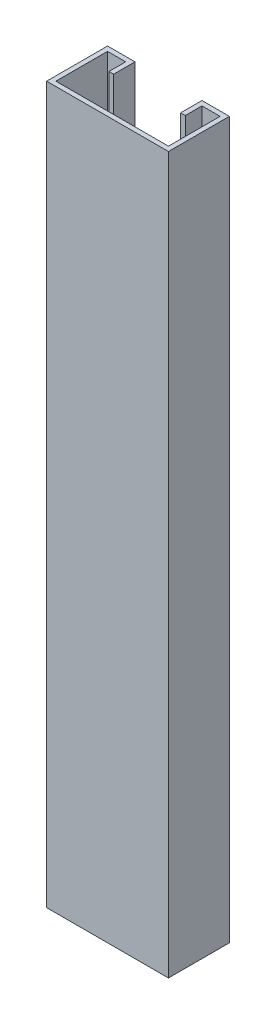
ISO-10303-21;
HEADER;
FILE_DESCRIPTION(('STEP AP214'),'2;1');
FILE_NAME('part.step','',(''),(''),'','','');
FILE_SCHEMA(('AUTOMOTIVE_DESIGN { 1 0 10303 214 1 1 1 1 }'));
ENDSEC;
DATA;
#1=APPLICATION_CONTEXT('core data for automotive mechanical design processes');
#2=APPLICATION_PROTOCOL_DEFINITION('international standard','automotive_design',2000,#1);
#3=PRODUCT_CONTEXT('',#1,'mechanical');
#4=PRODUCT('Part','Part','',(#3));
#5=PRODUCT_RELATED_PRODUCT_CATEGORY('part','',(#4));
#6=PRODUCT_DEFINITION_FORMATION('','',#4);
#7=PRODUCT_DEFINITION_CONTEXT('part definition',#1,'design');
#8=PRODUCT_DEFINITION('design','',#6,#7);
#9=PRODUCT_DEFINITION_SHAPE('','',#8);
#10=(LENGTH_UNIT() NAMED_UNIT(*) SI_UNIT(.MILLI.,.METRE.));
#11=(NAMED_UNIT(*) PLANE_ANGLE_UNIT() SI_UNIT($,.RADIAN.));
#12=(NAMED_UNIT(*) SI_UNIT($,.STERADIAN.) SOLID_ANGLE_UNIT());
#13=UNCERTAINTY_MEASURE_WITH_UNIT(LENGTH_MEASURE(1.E-05),#10,'distance_accuracy_value','');
#14=(GEOMETRIC_REPRESENTATION_CONTEXT(3) GLOBAL_UNCERTAINTY_ASSIGNED_CONTEXT((#13)) GLOBAL_UNIT_ASSIGNED_CONTEXT((#10,
#11,#12)) REPRESENTATION_CONTEXT('',''));
#15=CARTESIAN_POINT('',(0.,0.,0.));
#16=DIRECTION('',(0.,0.,1.));
#17=DIRECTION('',(1.,0.,0.));
#18=AXIS2_PLACEMENT_3D('',#15,#16,#17);
#19=CARTESIAN_POINT('',(-1.52,235.,0.));
#20=DIRECTION('',(0.,0.,-1.));
#21=DIRECTION('',(-1.,0.,0.));
#22=AXIS2_PLACEMENT_3D('',#19,#20,#21);
#23=PLANE('',#22);
#24=DIRECTION('',(1.,0.,0.));
#25=VECTOR('',#24,1.);
#26=CARTESIAN_POINT('',(-1.52,0.,0.));
#27=LINE('',#26,#25);
#28=CARTESIAN_POINT('',(-1.52,0.,0.));
#29=VERTEX_POINT('',#28);
#30=CARTESIAN_POINT('',(0.,0.,0.));
#31=VERTEX_POINT('',#30);
#32=EDGE_CURVE('E179',#29,#31,#27,.T.);
#33=ORIENTED_EDGE('',*,*,#32,.T.);
#34=DIRECTION('',(0.,-1.,0.));
#35=VECTOR('',#34,1.);
#36=CARTESIAN_POINT('',(0.,235.,0.));
#37=LINE('',#36,#35);
#38=CARTESIAN_POINT('',(0.,235.,0.));
#39=VERTEX_POINT('',#38);
#40=EDGE_CURVE('E11',#39,#31,#37,.T.);
#41=ORIENTED_EDGE('',*,*,#40,.F.);
#42=DIRECTION('',(1.,0.,0.));
#43=VECTOR('',#42,1.);
#44=CARTESIAN_POINT('',(-1.52,235.,0.));
#45=LINE('',#44,#43);
#46=CARTESIAN_POINT('',(-1.52,235.,0.));
#47=VERTEX_POINT('',#46);
#48=EDGE_CURVE('E209',#47,#39,#45,.T.);
#49=ORIENTED_EDGE('',*,*,#48,.F.);
#50=DIRECTION('',(0.,-1.,0.));
#51=VECTOR('',#50,1.);
#52=CARTESIAN_POINT('',(-1.52,235.,0.));
#53=LINE('',#52,#51);
#54=EDGE_CURVE('E175',#47,#29,#53,.T.);
#55=ORIENTED_EDGE('',*,*,#54,.T.);
#56=EDGE_LOOP('',(#33,#41,#49,#55));
#57=FACE_BOUND('',#56,.T.);
#58=ADVANCED_FACE('F35',(#57),#23,.F.);
#59=CARTESIAN_POINT('',(0.,235.,0.));
#60=DIRECTION('',(-1.,0.,0.));
#61=DIRECTION('',(0.,0.,1.));
#62=AXIS2_PLACEMENT_3D('',#59,#60,#61);
#63=PLANE('',#62);
#64=DIRECTION('',(0.,0.,-1.));
#65=VECTOR('',#64,1.);
#66=CARTESIAN_POINT('',(0.,0.,0.));
#67=LINE('',#66,#65);
#68=CARTESIAN_POINT('',(0.,0.,-7.));
#69=VERTEX_POINT('',#68);
#70=EDGE_CURVE('E182',#31,#69,#67,.T.);
#71=ORIENTED_EDGE('',*,*,#70,.T.);
#72=DIRECTION('',(0.,-1.,0.));
#73=VECTOR('',#72,1.);
#74=CARTESIAN_POINT('',(0.,235.,-7.));
#75=LINE('',#74,#73);
#76=CARTESIAN_POINT('',(0.,235.,-7.));
#77=VERTEX_POINT('',#76);
#78=EDGE_CURVE('E43',#77,#69,#75,.T.);
#79=ORIENTED_EDGE('',*,*,#78,.F.);
#80=DIRECTION('',(0.,0.,-1.));
#81=VECTOR('',#80,1.);
#82=CARTESIAN_POINT('',(0.,235.,0.));
#83=LINE('',#82,#81);
#84=EDGE_CURVE('E118',#39,#77,#83,.T.);
#85=ORIENTED_EDGE('',*,*,#84,.F.);
#86=ORIENTED_EDGE('',*,*,#40,.T.);
#87=EDGE_LOOP('',(#71,#79,#85,#86));
#88=FACE_BOUND('',#87,.T.);
#89=ADVANCED_FACE('F307',(#88),#63,.F.);
#90=CARTESIAN_POINT('',(0.,235.,-7.));
#91=DIRECTION('',(0.,0.,1.));
#92=DIRECTION('',(1.,0.,0.));
#93=AXIS2_PLACEMENT_3D('',#90,#91,#92);
#94=PLANE('',#93);
#95=DIRECTION('',(-1.,0.,0.));
#96=VECTOR('',#95,1.);
#97=CARTESIAN_POINT('',(0.,0.,-7.));
#98=LINE('',#97,#96);
#99=CARTESIAN_POINT('',(-9.,0.,-7.));
#100=VERTEX_POINT('',#99);
#101=EDGE_CURVE('E184',#69,#100,#98,.T.);
#102=ORIENTED_EDGE('',*,*,#101,.T.);
#103=DIRECTION('',(0.,-1.,0.));
#104=VECTOR('',#103,1.);
#105=CARTESIAN_POINT('',(-9.,235.,-7.));
#106=LINE('',#105,#104);
#107=CARTESIAN_POINT('',(-9.,235.,-7.));
#108=VERTEX_POINT('',#107);
#109=EDGE_CURVE('E240',#108,#100,#106,.T.);
#110=ORIENTED_EDGE('',*,*,#109,.F.);
#111=DIRECTION('',(-1.,0.,0.));
#112=VECTOR('',#111,1.);
#113=CARTESIAN_POINT('',(0.,235.,-7.));
#114=LINE('',#113,#112);
#115=EDGE_CURVE('E248',#77,#108,#114,.T.);
#116=ORIENTED_EDGE('',*,*,#115,.F.);
#117=ORIENTED_EDGE('',*,*,#78,.T.);
#118=EDGE_LOOP('',(#102,#110,#116,#117));
#119=FACE_BOUND('',#118,.T.);
#120=ADVANCED_FACE('F246',(#119),#94,.F.);
#121=CARTESIAN_POINT('',(-9.,235.,-7.));
#122=DIRECTION('',(1.,0.,0.));
#123=DIRECTION('',(0.,0.,-1.));
#124=AXIS2_PLACEMENT_3D('',#121,#122,#123);
#125=PLANE('',#124);
#126=DIRECTION('',(0.,0.,1.));
#127=VECTOR('',#126,1.);
#128=CARTESIAN_POINT('',(-9.,0.,-7.));
#129=LINE('',#128,#127);
#130=CARTESIAN_POINT('',(-9.,0.,13.));
#131=VERTEX_POINT('',#130);
#132=EDGE_CURVE('E186',#100,#131,#129,.T.);
#133=ORIENTED_EDGE('',*,*,#132,.T.);
#134=DIRECTION('',(0.,-1.,0.));
#135=VECTOR('',#134,1.);
#136=CARTESIAN_POINT('',(-9.,235.,13.));
#137=LINE('',#136,#135);
#138=CARTESIAN_POINT('',(-9.,235.,13.));
#139=VERTEX_POINT('',#138);
#140=EDGE_CURVE('E237',#139,#131,#137,.T.);
#141=ORIENTED_EDGE('',*,*,#140,.F.);
#142=DIRECTION('',(0.,0.,1.));
#143=VECTOR('',#142,1.);
#144=CARTESIAN_POINT('',(-9.,235.,-7.));
#145=LINE('',#144,#143);
#146=EDGE_CURVE('E266',#108,#139,#145,.T.);
#147=ORIENTED_EDGE('',*,*,#146,.F.);
#148=ORIENTED_EDGE('',*,*,#109,.T.);
#149=EDGE_LOOP('',(#133,#141,#147,#148));
#150=FACE_BOUND('',#149,.T.);
#151=ADVANCED_FACE('F257',(#150),#125,.F.);
#152=CARTESIAN_POINT('',(-9.,235.,13.));
#153=DIRECTION('',(0.,0.,-1.));
#154=DIRECTION('',(-1.,0.,0.));
#155=AXIS2_PLACEMENT_3D('',#152,#153,#154);
#156=PLANE('',#155);
#157=DIRECTION('',(1.,0.,0.));
#158=VECTOR('',#157,1.);
#159=CARTESIAN_POINT('',(-9.,0.,13.));
#160=LINE('',#159,#158);
#161=CARTESIAN_POINT('',(31.,0.,13.));
#162=VERTEX_POINT('',#161);
#163=EDGE_CURVE('E188',#131,#162,#160,.T.);
#164=ORIENTED_EDGE('',*,*,#163,.T.);
#165=DIRECTION('',(0.,-1.,0.));
#166=VECTOR('',#165,1.);
#167=CARTESIAN_POINT('',(31.,235.,13.));
#168=LINE('',#167,#166);
#169=CARTESIAN_POINT('',(31.,235.,13.));
#170=VERTEX_POINT('',#169);
#171=EDGE_CURVE('E234',#170,#162,#168,.T.);
#172=ORIENTED_EDGE('',*,*,#171,.F.);
#173=DIRECTION('',(1.,0.,0.));
#174=VECTOR('',#173,1.);
#175=CARTESIAN_POINT('',(-9.,235.,13.));
#176=LINE('',#175,#174);
#177=EDGE_CURVE('E263',#139,#170,#176,.T.);
#178=ORIENTED_EDGE('',*,*,#177,.F.);
#179=ORIENTED_EDGE('',*,*,#140,.T.);
#180=EDGE_LOOP('',(#164,#172,#178,#179));
#181=FACE_BOUND('',#180,.T.);
#182=ADVANCED_FACE('F261',(#181),#156,.F.);
#183=CARTESIAN_POINT('',(31.,235.,13.));
#184=DIRECTION('',(-1.,0.,0.));
#185=DIRECTION('',(0.,0.,1.));
#186=AXIS2_PLACEMENT_3D('',#183,#184,#185);
#187=PLANE('',#186);
#188=DIRECTION('',(0.,0.,-1.));
#189=VECTOR('',#188,1.);
#190=CARTESIAN_POINT('',(31.,0.,13.));
#191=LINE('',#190,#189);
#192=CARTESIAN_POINT('',(31.,0.,-7.));
#193=VERTEX_POINT('',#192);
#194=EDGE_CURVE('E190',#162,#193,#191,.T.);
#195=ORIENTED_EDGE('',*,*,#194,.T.);
#196=DIRECTION('',(0.,-1.,0.));
#197=VECTOR('',#196,1.);
#198=CARTESIAN_POINT('',(31.,235.,-7.));
#199=LINE('',#198,#197);
#200=CARTESIAN_POINT('',(31.,235.,-7.));
#201=VERTEX_POINT('',#200);
#202=EDGE_CURVE('E231',#201,#193,#199,.T.);
#203=ORIENTED_EDGE('',*,*,#202,.F.);
#204=DIRECTION('',(0.,0.,-1.));
#205=VECTOR('',#204,1.);
#206=CARTESIAN_POINT('',(31.,235.,13.));
#207=LINE('',#206,#205);
#208=EDGE_CURVE('E265',#170,#201,#207,.T.);
#209=ORIENTED_EDGE('',*,*,#208,.F.);
#210=ORIENTED_EDGE('',*,*,#171,.T.);
#211=EDGE_LOOP('',(#195,#203,#209,#210));
#212=FACE_BOUND('',#211,.T.);
#213=ADVANCED_FACE('F320',(#212),#187,.F.);
#214=CARTESIAN_POINT('',(31.,235.,-7.));
#215=DIRECTION('',(0.,0.,1.));
#216=DIRECTION('',(1.,0.,0.));
#217=AXIS2_PLACEMENT_3D('',#214,#215,#216);
#218=PLANE('',#217);
#219=DIRECTION('',(-1.,0.,0.));
#220=VECTOR('',#219,1.);
#221=CARTESIAN_POINT('',(31.,0.,-7.));
#222=LINE('',#221,#220);
#223=CARTESIAN_POINT('',(22.,0.,-7.));
#224=VERTEX_POINT('',#223);
#225=EDGE_CURVE('E192',#193,#224,#222,.T.);
#226=ORIENTED_EDGE('',*,*,#225,.T.);
#227=DIRECTION('',(0.,-1.,0.));
#228=VECTOR('',#227,1.);
#229=CARTESIAN_POINT('',(22.,235.,-7.));
#230=LINE('',#229,#228);
#231=CARTESIAN_POINT('',(22.,235.,-7.));
#232=VERTEX_POINT('',#231);
#233=EDGE_CURVE('E228',#232,#224,#230,.T.);
#234=ORIENTED_EDGE('',*,*,#233,.F.);
#235=DIRECTION('',(-1.,0.,0.));
#236=VECTOR('',#235,1.);
#237=CARTESIAN_POINT('',(31.,235.,-7.));
#238=LINE('',#237,#236);
#239=EDGE_CURVE('E268',#201,#232,#238,.T.);
#240=ORIENTED_EDGE('',*,*,#239,.F.);
#241=ORIENTED_EDGE('',*,*,#202,.T.);
#242=EDGE_LOOP('',(#226,#234,#240,#241));
#243=FACE_BOUND('',#242,.T.);
#244=ADVANCED_FACE('F323',(#243),#218,.F.);
#245=CARTESIAN_POINT('',(22.,235.,-7.));
#246=DIRECTION('',(1.,0.,0.));
#247=DIRECTION('',(0.,0.,-1.));
#248=AXIS2_PLACEMENT_3D('',#245,#246,#247);
#249=PLANE('',#248);
#250=DIRECTION('',(0.,0.,1.));
#251=VECTOR('',#250,1.);
#252=CARTESIAN_POINT('',(22.,0.,-7.));
#253=LINE('',#252,#251);
#254=CARTESIAN_POINT('',(22.,0.,0.));
#255=VERTEX_POINT('',#254);
#256=EDGE_CURVE('E194',#224,#255,#253,.T.);
#257=ORIENTED_EDGE('',*,*,#256,.T.);
#258=DIRECTION('',(0.,-1.,0.));
#259=VECTOR('',#258,1.);
#260=CARTESIAN_POINT('',(22.,235.,0.));
#261=LINE('',#260,#259);
#262=CARTESIAN_POINT('',(22.,235.,0.));
#263=VERTEX_POINT('',#262);
#264=EDGE_CURVE('E225',#263,#255,#261,.T.);
#265=ORIENTED_EDGE('',*,*,#264,.F.);
#266=DIRECTION('',(0.,0.,1.));
#267=VECTOR('',#266,1.);
#268=CARTESIAN_POINT('',(22.,235.,-7.));
#269=LINE('',#268,#267);
#270=EDGE_CURVE('E274',#232,#263,#269,.T.);
#271=ORIENTED_EDGE('',*,*,#270,.F.);
#272=ORIENTED_EDGE('',*,*,#233,.T.);
#273=EDGE_LOOP('',(#257,#265,#271,#272));
#274=FACE_BOUND('',#273,.T.);
#275=ADVANCED_FACE('F327',(#274),#249,.F.);
#276=CARTESIAN_POINT('',(22.,235.,0.));
#277=DIRECTION('',(0.,0.,-1.));
#278=DIRECTION('',(-1.,0.,0.));
#279=AXIS2_PLACEMENT_3D('',#276,#277,#278);
#280=PLANE('',#279);
#281=DIRECTION('',(1.,0.,0.));
#282=VECTOR('',#281,1.);
#283=CARTESIAN_POINT('',(22.,0.,0.));
#284=LINE('',#283,#282);
#285=CARTESIAN_POINT('',(23.52,0.,0.));
#286=VERTEX_POINT('',#285);
#287=EDGE_CURVE('E196',#255,#286,#284,.T.);
#288=ORIENTED_EDGE('',*,*,#287,.T.);
#289=DIRECTION('',(0.,-1.,0.));
#290=VECTOR('',#289,1.);
#291=CARTESIAN_POINT('',(23.52,235.,0.));
#292=LINE('',#291,#290);
#293=CARTESIAN_POINT('',(23.52,235.,0.));
#294=VERTEX_POINT('',#293);
#295=EDGE_CURVE('E222',#294,#286,#292,.T.);
#296=ORIENTED_EDGE('',*,*,#295,.F.);
#297=DIRECTION('',(1.,0.,0.));
#298=VECTOR('',#297,1.);
#299=CARTESIAN_POINT('',(22.,235.,0.));
#300=LINE('',#299,#298);
#301=EDGE_CURVE('E276',#263,#294,#300,.T.);
#302=ORIENTED_EDGE('',*,*,#301,.F.);
#303=ORIENTED_EDGE('',*,*,#264,.T.);
#304=EDGE_LOOP('',(#288,#296,#302,#303));
#305=FACE_BOUND('',#304,.T.);
#306=ADVANCED_FACE('F331',(#305),#280,.F.);
#307=CARTESIAN_POINT('',(23.52,235.,-5.48));
#308=DIRECTION('',(-1.,0.,0.));
#309=DIRECTION('',(0.,0.,1.));
#310=AXIS2_PLACEMENT_3D('',#307,#308,#309);
#311=PLANE('',#310);
#312=DIRECTION('',(0.,0.,-1.));
#313=VECTOR('',#312,1.);
#314=CARTESIAN_POINT('',(23.52,0.,-5.48));
#315=LINE('',#314,#313);
#316=CARTESIAN_POINT('',(23.52,0.,-5.48));
#317=VERTEX_POINT('',#316);
#318=EDGE_CURVE('E198',#286,#317,#315,.T.);
#319=ORIENTED_EDGE('',*,*,#318,.T.);
#320=DIRECTION('',(0.,-1.,0.));
#321=VECTOR('',#320,1.);
#322=CARTESIAN_POINT('',(23.52,235.,-5.48));
#323=LINE('',#322,#321);
#324=CARTESIAN_POINT('',(23.52,235.,-5.48));
#325=VERTEX_POINT('',#324);
#326=EDGE_CURVE('E219',#325,#317,#323,.T.);
#327=ORIENTED_EDGE('',*,*,#326,.F.);
#328=DIRECTION('',(0.,0.,-1.));
#329=VECTOR('',#328,1.);
#330=CARTESIAN_POINT('',(23.52,235.,-5.48));
#331=LINE('',#330,#329);
#332=EDGE_CURVE('E278',#294,#325,#331,.T.);
#333=ORIENTED_EDGE('',*,*,#332,.F.);
#334=ORIENTED_EDGE('',*,*,#295,.T.);
#335=EDGE_LOOP('',(#319,#327,#333,#334));
#336=FACE_BOUND('',#335,.T.);
#337=ADVANCED_FACE('F335',(#336),#311,.F.);
#338=CARTESIAN_POINT('',(29.48,235.,-5.48));
#339=DIRECTION('',(0.,0.,-1.));
#340=DIRECTION('',(-1.,0.,0.));
#341=AXIS2_PLACEMENT_3D('',#338,#339,#340);
#342=PLANE('',#341);
#343=DIRECTION('',(1.,0.,0.));
#344=VECTOR('',#343,1.);
#345=CARTESIAN_POINT('',(29.48,0.,-5.48));
#346=LINE('',#345,#344);
#347=CARTESIAN_POINT('',(29.48,0.,-5.48));
#348=VERTEX_POINT('',#347);
#349=EDGE_CURVE('E200',#317,#348,#346,.T.);
#350=ORIENTED_EDGE('',*,*,#349,.T.);
#351=DIRECTION('',(0.,-1.,0.));
#352=VECTOR('',#351,1.);
#353=CARTESIAN_POINT('',(29.48,235.,-5.48));
#354=LINE('',#353,#352);
#355=CARTESIAN_POINT('',(29.48,235.,-5.48));
#356=VERTEX_POINT('',#355);
#357=EDGE_CURVE('E216',#356,#348,#354,.T.);
#358=ORIENTED_EDGE('',*,*,#357,.F.);
#359=DIRECTION('',(1.,0.,0.));
#360=VECTOR('',#359,1.);
#361=CARTESIAN_POINT('',(29.48,235.,-5.48));
#362=LINE('',#361,#360);
#363=EDGE_CURVE('E280',#325,#356,#362,.T.);
#364=ORIENTED_EDGE('',*,*,#363,.F.);
#365=ORIENTED_EDGE('',*,*,#326,.T.);
#366=EDGE_LOOP('',(#350,#358,#364,#365));
#367=FACE_BOUND('',#366,.T.);
#368=ADVANCED_FACE('F339',(#367),#342,.F.);
#369=CARTESIAN_POINT('',(29.48,235.,11.48));
#370=DIRECTION('',(1.,0.,0.));
#371=DIRECTION('',(0.,0.,-1.));
#372=AXIS2_PLACEMENT_3D('',#369,#370,#371);
#373=PLANE('',#372);
#374=DIRECTION('',(0.,0.,1.));
#375=VECTOR('',#374,1.);
#376=CARTESIAN_POINT('',(29.48,0.,11.48));
#377=LINE('',#376,#375);
#378=CARTESIAN_POINT('',(29.48,0.,11.48));
#379=VERTEX_POINT('',#378);
#380=EDGE_CURVE('E202',#348,#379,#377,.T.);
#381=ORIENTED_EDGE('',*,*,#380,.T.);
#382=DIRECTION('',(0.,-1.,0.));
#383=VECTOR('',#382,1.);
#384=CARTESIAN_POINT('',(29.48,235.,11.48));
#385=LINE('',#384,#383);
#386=CARTESIAN_POINT('',(29.48,235.,11.48));
#387=VERTEX_POINT('',#386);
#388=EDGE_CURVE('E213',#387,#379,#385,.T.);
#389=ORIENTED_EDGE('',*,*,#388,.F.);
#390=DIRECTION('',(0.,0.,1.));
#391=VECTOR('',#390,1.);
#392=CARTESIAN_POINT('',(29.48,235.,11.48));
#393=LINE('',#392,#391);
#394=EDGE_CURVE('E282',#356,#387,#393,.T.);
#395=ORIENTED_EDGE('',*,*,#394,.F.);
#396=ORIENTED_EDGE('',*,*,#357,.T.);
#397=EDGE_LOOP('',(#381,#389,#395,#396));
#398=FACE_BOUND('',#397,.T.);
#399=ADVANCED_FACE('F288',(#398),#373,.F.);
#400=CARTESIAN_POINT('',(-7.48,235.,11.48));
#401=DIRECTION('',(0.,0.,1.));
#402=DIRECTION('',(1.,0.,0.));
#403=AXIS2_PLACEMENT_3D('',#400,#401,#402);
#404=PLANE('',#403);
#405=DIRECTION('',(-1.,0.,0.));
#406=VECTOR('',#405,1.);
#407=CARTESIAN_POINT('',(-7.48,0.,11.48));
#408=LINE('',#407,#406);
#409=CARTESIAN_POINT('',(-7.48,0.,11.48));
#410=VERTEX_POINT('',#409);
#411=EDGE_CURVE('E204',#379,#410,#408,.T.);
#412=ORIENTED_EDGE('',*,*,#411,.T.);
#413=DIRECTION('',(0.,-1.,0.));
#414=VECTOR('',#413,1.);
#415=CARTESIAN_POINT('',(-7.48,235.,11.48));
#416=LINE('',#415,#414);
#417=CARTESIAN_POINT('',(-7.48,235.,11.48));
#418=VERTEX_POINT('',#417);
#419=EDGE_CURVE('E170',#418,#410,#416,.T.);
#420=ORIENTED_EDGE('',*,*,#419,.F.);
#421=DIRECTION('',(-1.,0.,0.));
#422=VECTOR('',#421,1.);
#423=CARTESIAN_POINT('',(-7.48,235.,11.48));
#424=LINE('',#423,#422);
#425=EDGE_CURVE('E161',#387,#418,#424,.T.);
#426=ORIENTED_EDGE('',*,*,#425,.F.);
#427=ORIENTED_EDGE('',*,*,#388,.T.);
#428=EDGE_LOOP('',(#412,#420,#426,#427));
#429=FACE_BOUND('',#428,.T.);
#430=ADVANCED_FACE('F292',(#429),#404,.F.);
#431=CARTESIAN_POINT('',(-7.48,235.,-5.48));
#432=DIRECTION('',(-1.,0.,0.));
#433=DIRECTION('',(0.,0.,1.));
#434=AXIS2_PLACEMENT_3D('',#431,#432,#433);
#435=PLANE('',#434);
#436=DIRECTION('',(0.,0.,-1.));
#437=VECTOR('',#436,1.);
#438=CARTESIAN_POINT('',(-7.48,0.,-5.48));
#439=LINE('',#438,#437);
#440=CARTESIAN_POINT('',(-7.48,0.,-5.48));
#441=VERTEX_POINT('',#440);
#442=EDGE_CURVE('E169',#410,#441,#439,.T.);
#443=ORIENTED_EDGE('',*,*,#442,.T.);
#444=DIRECTION('',(0.,-1.,0.));
#445=VECTOR('',#444,1.);
#446=CARTESIAN_POINT('',(-7.48,235.,-5.48));
#447=LINE('',#446,#445);
#448=CARTESIAN_POINT('',(-7.48,235.,-5.48));
#449=VERTEX_POINT('',#448);
#450=EDGE_CURVE('E166',#449,#441,#447,.T.);
#451=ORIENTED_EDGE('',*,*,#450,.F.);
#452=DIRECTION('',(0.,0.,-1.));
#453=VECTOR('',#452,1.);
#454=CARTESIAN_POINT('',(-7.48,235.,-5.48));
#455=LINE('',#454,#453);
#456=EDGE_CURVE('E155',#418,#449,#455,.T.);
#457=ORIENTED_EDGE('',*,*,#456,.F.);
#458=ORIENTED_EDGE('',*,*,#419,.T.);
#459=EDGE_LOOP('',(#443,#451,#457,#458));
#460=FACE_BOUND('',#459,.T.);
#461=ADVANCED_FACE('F167',(#460),#435,.F.);
#462=CARTESIAN_POINT('',(-1.52,235.,-5.48));
#463=DIRECTION('',(0.,0.,-1.));
#464=DIRECTION('',(-1.,0.,0.));
#465=AXIS2_PLACEMENT_3D('',#462,#463,#464);
#466=PLANE('',#465);
#467=DIRECTION('',(1.,0.,0.));
#468=VECTOR('',#467,1.);
#469=CARTESIAN_POINT('',(-1.52,0.,-5.48));
#470=LINE('',#469,#468);
#471=CARTESIAN_POINT('',(-1.52,0.,-5.48));
#472=VERTEX_POINT('',#471);
#473=EDGE_CURVE('E104',#441,#472,#470,.T.);
#474=ORIENTED_EDGE('',*,*,#473,.T.);
#475=DIRECTION('',(0.,-1.,0.));
#476=VECTOR('',#475,1.);
#477=CARTESIAN_POINT('',(-1.52,235.,-5.48));
#478=LINE('',#477,#476);
#479=CARTESIAN_POINT('',(-1.52,235.,-5.48));
#480=VERTEX_POINT('',#479);
#481=EDGE_CURVE('E171',#480,#472,#478,.T.);
#482=ORIENTED_EDGE('',*,*,#481,.F.);
#483=DIRECTION('',(1.,0.,0.));
#484=VECTOR('',#483,1.);
#485=CARTESIAN_POINT('',(-1.52,235.,-5.48));
#486=LINE('',#485,#484);
#487=EDGE_CURVE('E159',#449,#480,#486,.T.);
#488=ORIENTED_EDGE('',*,*,#487,.F.);
#489=ORIENTED_EDGE('',*,*,#450,.T.);
#490=EDGE_LOOP('',(#474,#482,#488,#489));
#491=FACE_BOUND('',#490,.T.);
#492=ADVANCED_FACE('F173',(#491),#466,.F.);
#493=CARTESIAN_POINT('',(-1.52,235.,0.));
#494=DIRECTION('',(1.,0.,0.));
#495=DIRECTION('',(0.,0.,-1.));
#496=AXIS2_PLACEMENT_3D('',#493,#494,#495);
#497=PLANE('',#496);
#498=DIRECTION('',(0.,0.,1.));
#499=VECTOR('',#498,1.);
#500=CARTESIAN_POINT('',(-1.52,0.,0.));
#501=LINE('',#500,#499);
#502=EDGE_CURVE('E110',#472,#29,#501,.T.);
#503=ORIENTED_EDGE('',*,*,#502,.T.);
#504=ORIENTED_EDGE('',*,*,#54,.F.);
#505=DIRECTION('',(0.,0.,1.));
#506=VECTOR('',#505,1.);
#507=CARTESIAN_POINT('',(-1.52,235.,0.));
#508=LINE('',#507,#506);
#509=EDGE_CURVE('E51',#480,#47,#508,.T.);
#510=ORIENTED_EDGE('',*,*,#509,.F.);
#511=ORIENTED_EDGE('',*,*,#481,.T.);
#512=EDGE_LOOP('',(#503,#504,#510,#511));
#513=FACE_BOUND('',#512,.T.);
#514=ADVANCED_FACE('F296',(#513),#497,.F.);
#515=CARTESIAN_POINT('',(0.,235.,0.));
#516=DIRECTION('',(0.,1.,0.));
#517=DIRECTION('',(0.,0.,1.));
#518=AXIS2_PLACEMENT_3D('',#515,#516,#517);
#519=PLANE('',#518);
#520=ORIENTED_EDGE('',*,*,#48,.T.);
#521=ORIENTED_EDGE('',*,*,#84,.T.);
#522=ORIENTED_EDGE('',*,*,#115,.T.);
#523=ORIENTED_EDGE('',*,*,#146,.T.);
#524=ORIENTED_EDGE('',*,*,#177,.T.);
#525=ORIENTED_EDGE('',*,*,#208,.T.);
#526=ORIENTED_EDGE('',*,*,#239,.T.);
#527=ORIENTED_EDGE('',*,*,#270,.T.);
#528=ORIENTED_EDGE('',*,*,#301,.T.);
#529=ORIENTED_EDGE('',*,*,#332,.T.);
#530=ORIENTED_EDGE('',*,*,#363,.T.);
#531=ORIENTED_EDGE('',*,*,#394,.T.);
#532=ORIENTED_EDGE('',*,*,#425,.T.);
#533=ORIENTED_EDGE('',*,*,#456,.T.);
#534=ORIENTED_EDGE('',*,*,#487,.T.);
#535=ORIENTED_EDGE('',*,*,#509,.T.);
#536=EDGE_LOOP('',(#520,#521,#522,#523,#524,#525,#526,#527,#528,#529,#530,#531,#532,#533,#534,#535));
#537=FACE_BOUND('',#536,.T.);
#538=ADVANCED_FACE('F157',(#537),#519,.T.);
#539=CARTESIAN_POINT('',(0.,0.,0.));
#540=DIRECTION('',(0.,1.,0.));
#541=DIRECTION('',(0.,0.,1.));
#542=AXIS2_PLACEMENT_3D('',#539,#540,#541);
#543=PLANE('',#542);
#544=ORIENTED_EDGE('',*,*,#32,.F.);
#545=ORIENTED_EDGE('',*,*,#502,.F.);
#546=ORIENTED_EDGE('',*,*,#473,.F.);
#547=ORIENTED_EDGE('',*,*,#442,.F.);
#548=ORIENTED_EDGE('',*,*,#411,.F.);
#549=ORIENTED_EDGE('',*,*,#380,.F.);
#550=ORIENTED_EDGE('',*,*,#349,.F.);
#551=ORIENTED_EDGE('',*,*,#318,.F.);
#552=ORIENTED_EDGE('',*,*,#287,.F.);
#553=ORIENTED_EDGE('',*,*,#256,.F.);
#554=ORIENTED_EDGE('',*,*,#225,.F.);
#555=ORIENTED_EDGE('',*,*,#194,.F.);
#556=ORIENTED_EDGE('',*,*,#163,.F.);
#557=ORIENTED_EDGE('',*,*,#132,.F.);
#558=ORIENTED_EDGE('',*,*,#101,.F.);
#559=ORIENTED_EDGE('',*,*,#70,.F.);
#560=EDGE_LOOP('',(#544,#545,#546,#547,#548,#549,#550,#551,#552,#553,#554,#555,#556,#557,#558,#559));
#561=FACE_BOUND('',#560,.T.);
#562=ADVANCED_FACE('F252',(#561),#543,.F.);
#563=CLOSED_SHELL('',(#58,#89,#120,#151,#182,#213,#244,#275,#306,#337,#368,#399,#430,#461,#492,
#514,#538,#562));
#564=MANIFOLD_SOLID_BREP('B2',#563);
#565=ADVANCED_BREP_SHAPE_REPRESENTATION('',(#18,#564),#14);
#566=SHAPE_DEFINITION_REPRESENTATION(#9,#565);
ENDSEC;
END-ISO-10303-21;
